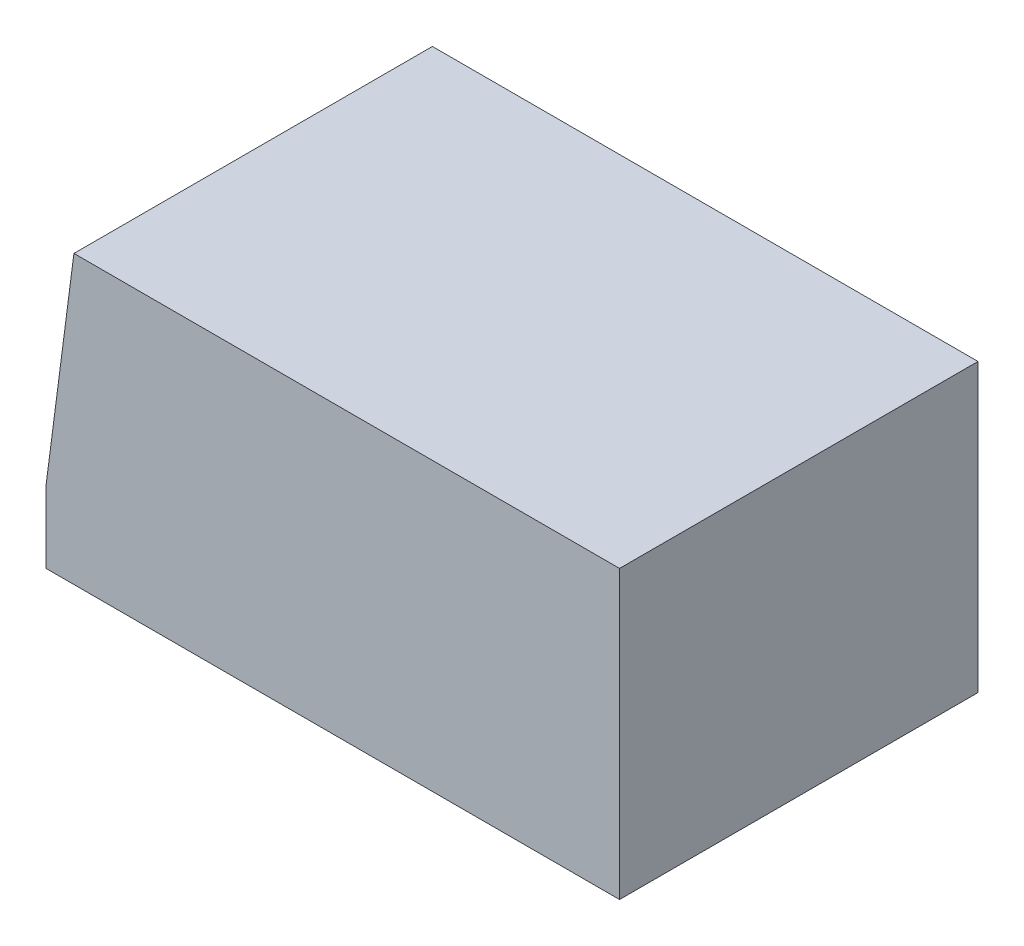
ISO-10303-21;
HEADER;
FILE_DESCRIPTION(('STEP AP214'),'2;1');
FILE_NAME('part.step','',(''),(''),'','','');
FILE_SCHEMA(('AUTOMOTIVE_DESIGN { 1 0 10303 214 1 1 1 1 }'));
ENDSEC;
DATA;
#1=APPLICATION_CONTEXT('core data for automotive mechanical design processes');
#2=APPLICATION_PROTOCOL_DEFINITION('international standard','automotive_design',2000,#1);
#3=PRODUCT_CONTEXT('',#1,'mechanical');
#4=PRODUCT('Part','Part','',(#3));
#5=PRODUCT_RELATED_PRODUCT_CATEGORY('part','',(#4));
#6=PRODUCT_DEFINITION_FORMATION('','',#4);
#7=PRODUCT_DEFINITION_CONTEXT('part definition',#1,'design');
#8=PRODUCT_DEFINITION('design','',#6,#7);
#9=PRODUCT_DEFINITION_SHAPE('','',#8);
#10=(LENGTH_UNIT() NAMED_UNIT(*) SI_UNIT(.MILLI.,.METRE.));
#11=(NAMED_UNIT(*) PLANE_ANGLE_UNIT() SI_UNIT($,.RADIAN.));
#12=(NAMED_UNIT(*) SI_UNIT($,.STERADIAN.) SOLID_ANGLE_UNIT());
#13=UNCERTAINTY_MEASURE_WITH_UNIT(LENGTH_MEASURE(1.E-05),#10,'distance_accuracy_value','');
#14=(GEOMETRIC_REPRESENTATION_CONTEXT(3) GLOBAL_UNCERTAINTY_ASSIGNED_CONTEXT((#13)) GLOBAL_UNIT_ASSIGNED_CONTEXT((#10,
#11,#12)) REPRESENTATION_CONTEXT('',''));
#15=CARTESIAN_POINT('',(0.,0.,0.));
#16=DIRECTION('',(0.,0.,1.));
#17=DIRECTION('',(1.,0.,0.));
#18=AXIS2_PLACEMENT_3D('',#15,#16,#17);
#19=CARTESIAN_POINT('',(40.,40.,25.));
#20=DIRECTION('',(-1.,0.,0.));
#21=DIRECTION('',(0.,0.,1.));
#22=AXIS2_PLACEMENT_3D('',#19,#20,#21);
#23=PLANE('',#22);
#24=DIRECTION('',(0.,0.,-1.));
#25=VECTOR('',#24,1.);
#26=CARTESIAN_POINT('',(40.,0.,25.));
#27=LINE('',#26,#25);
#28=CARTESIAN_POINT('',(40.,0.,25.));
#29=VERTEX_POINT('',#28);
#30=CARTESIAN_POINT('',(40.,0.,-25.));
#31=VERTEX_POINT('',#30);
#32=EDGE_CURVE('E100',#29,#31,#27,.T.);
#33=ORIENTED_EDGE('',*,*,#32,.T.);
#34=DIRECTION('',(0.,-1.,0.));
#35=VECTOR('',#34,1.);
#36=CARTESIAN_POINT('',(40.,40.,-25.));
#37=LINE('',#36,#35);
#38=CARTESIAN_POINT('',(40.,40.,-25.));
#39=VERTEX_POINT('',#38);
#40=EDGE_CURVE('E83',#39,#31,#37,.T.);
#41=ORIENTED_EDGE('',*,*,#40,.F.);
#42=DIRECTION('',(0.,0.,-1.));
#43=VECTOR('',#42,1.);
#44=CARTESIAN_POINT('',(40.,40.,25.));
#45=LINE('',#44,#43);
#46=CARTESIAN_POINT('',(40.,40.,25.));
#47=VERTEX_POINT('',#46);
#48=EDGE_CURVE('E90',#47,#39,#45,.T.);
#49=ORIENTED_EDGE('',*,*,#48,.F.);
#50=DIRECTION('',(0.,-1.,0.));
#51=VECTOR('',#50,1.);
#52=CARTESIAN_POINT('',(40.,40.,25.));
#53=LINE('',#52,#51);
#54=EDGE_CURVE('E110',#47,#29,#53,.T.);
#55=ORIENTED_EDGE('',*,*,#54,.T.);
#56=EDGE_LOOP('',(#33,#41,#49,#55));
#57=FACE_BOUND('',#56,.T.);
#58=ADVANCED_FACE('F33',(#57),#23,.F.);
#59=CARTESIAN_POINT('',(-40.,40.,-25.));
#60=DIRECTION('',(0.,0.,1.));
#61=DIRECTION('',(1.,0.,0.));
#62=AXIS2_PLACEMENT_3D('',#59,#60,#61);
#63=PLANE('',#62);
#64=DIRECTION('',(0.,-1.,0.));
#65=VECTOR('',#64,1.);
#66=CARTESIAN_POINT('',(-40.,40.,-25.));
#67=LINE('',#66,#65);
#68=CARTESIAN_POINT('',(-40.,9.99999999999921,-25.));
#69=VERTEX_POINT('',#68);
#70=CARTESIAN_POINT('',(-40.,0.,-25.));
#71=VERTEX_POINT('',#70);
#72=EDGE_CURVE('E102',#69,#71,#67,.T.);
#73=ORIENTED_EDGE('',*,*,#72,.F.);
#74=DIRECTION('',(-0.12879559657756,-0.991671162383091,0.));
#75=VECTOR('',#74,1.);
#76=CARTESIAN_POINT('',(-36.1036802884924,40.,-25.));
#77=LINE('',#76,#75);
#78=CARTESIAN_POINT('',(-36.1036802884924,40.,-25.));
#79=VERTEX_POINT('',#78);
#80=EDGE_CURVE('E11',#69,#79,#77,.F.);
#81=ORIENTED_EDGE('',*,*,#80,.T.);
#82=DIRECTION('',(-1.,0.,0.));
#83=VECTOR('',#82,1.);
#84=CARTESIAN_POINT('',(-40.,40.,-25.));
#85=LINE('',#84,#83);
#86=EDGE_CURVE('E78',#39,#79,#85,.T.);
#87=ORIENTED_EDGE('',*,*,#86,.F.);
#88=ORIENTED_EDGE('',*,*,#40,.T.);
#89=DIRECTION('',(-1.,0.,0.));
#90=VECTOR('',#89,1.);
#91=CARTESIAN_POINT('',(-40.,0.,-25.));
#92=LINE('',#91,#90);
#93=EDGE_CURVE('E116',#31,#71,#92,.T.);
#94=ORIENTED_EDGE('',*,*,#93,.T.);
#95=EDGE_LOOP('',(#73,#81,#87,#88,#94));
#96=FACE_BOUND('',#95,.T.);
#97=ADVANCED_FACE('F80',(#96),#63,.F.);
#98=CARTESIAN_POINT('',(-40.,40.,25.));
#99=DIRECTION('',(1.,0.,0.));
#100=DIRECTION('',(0.,0.,-1.));
#101=AXIS2_PLACEMENT_3D('',#98,#99,#100);
#102=PLANE('',#101);
#103=DIRECTION('',(0.,-1.,0.));
#104=VECTOR('',#103,1.);
#105=CARTESIAN_POINT('',(-40.,40.,25.));
#106=LINE('',#105,#104);
#107=CARTESIAN_POINT('',(-40.,9.99999999999921,25.));
#108=VERTEX_POINT('',#107);
#109=CARTESIAN_POINT('',(-40.,0.,25.));
#110=VERTEX_POINT('',#109);
#111=EDGE_CURVE('E105',#108,#110,#106,.T.);
#112=ORIENTED_EDGE('',*,*,#111,.F.);
#113=DIRECTION('',(0.,0.,-1.));
#114=VECTOR('',#113,1.);
#115=CARTESIAN_POINT('',(-40.,9.99999999999921,25.));
#116=LINE('',#115,#114);
#117=EDGE_CURVE('E41',#108,#69,#116,.T.);
#118=ORIENTED_EDGE('',*,*,#117,.T.);
#119=ORIENTED_EDGE('',*,*,#72,.T.);
#120=DIRECTION('',(0.,0.,1.));
#121=VECTOR('',#120,1.);
#122=CARTESIAN_POINT('',(-40.,0.,25.));
#123=LINE('',#122,#121);
#124=EDGE_CURVE('E113',#71,#110,#123,.T.);
#125=ORIENTED_EDGE('',*,*,#124,.T.);
#126=EDGE_LOOP('',(#112,#118,#119,#125));
#127=FACE_BOUND('',#126,.T.);
#128=ADVANCED_FACE('F142',(#127),#102,.F.);
#129=CARTESIAN_POINT('',(-40.,40.,25.));
#130=DIRECTION('',(0.,0.,-1.));
#131=DIRECTION('',(-1.,0.,0.));
#132=AXIS2_PLACEMENT_3D('',#129,#130,#131);
#133=PLANE('',#132);
#134=DIRECTION('',(1.,0.,0.));
#135=VECTOR('',#134,1.);
#136=CARTESIAN_POINT('',(-40.,40.,25.));
#137=LINE('',#136,#135);
#138=CARTESIAN_POINT('',(-36.1036802884924,40.,25.));
#139=VERTEX_POINT('',#138);
#140=EDGE_CURVE('E89',#139,#47,#137,.T.);
#141=ORIENTED_EDGE('',*,*,#140,.F.);
#142=DIRECTION('',(0.12879559657756,0.991671162383091,0.));
#143=VECTOR('',#142,1.);
#144=CARTESIAN_POINT('',(-36.1036802884924,40.,25.));
#145=LINE('',#144,#143);
#146=EDGE_CURVE('E55',#139,#108,#145,.F.);
#147=ORIENTED_EDGE('',*,*,#146,.T.);
#148=ORIENTED_EDGE('',*,*,#111,.T.);
#149=DIRECTION('',(1.,0.,0.));
#150=VECTOR('',#149,1.);
#151=CARTESIAN_POINT('',(-40.,0.,25.));
#152=LINE('',#151,#150);
#153=EDGE_CURVE('E97',#110,#29,#152,.T.);
#154=ORIENTED_EDGE('',*,*,#153,.T.);
#155=ORIENTED_EDGE('',*,*,#54,.F.);
#156=EDGE_LOOP('',(#141,#147,#148,#154,#155));
#157=FACE_BOUND('',#156,.T.);
#158=ADVANCED_FACE('F138',(#157),#133,.F.);
#159=CARTESIAN_POINT('',(0.,40.,0.));
#160=DIRECTION('',(0.,-1.,0.));
#161=DIRECTION('',(0.,0.,-1.));
#162=AXIS2_PLACEMENT_3D('',#159,#160,#161);
#163=PLANE('',#162);
#164=ORIENTED_EDGE('',*,*,#86,.T.);
#165=DIRECTION('',(0.,0.,1.));
#166=VECTOR('',#165,1.);
#167=CARTESIAN_POINT('',(-36.1036802884924,40.,0.));
#168=LINE('',#167,#166);
#169=EDGE_CURVE('E101',#79,#139,#168,.T.);
#170=ORIENTED_EDGE('',*,*,#169,.T.);
#171=ORIENTED_EDGE('',*,*,#140,.T.);
#172=ORIENTED_EDGE('',*,*,#48,.T.);
#173=EDGE_LOOP('',(#164,#170,#171,#172));
#174=FACE_BOUND('',#173,.T.);
#175=ADVANCED_FACE('F93',(#174),#163,.F.);
#176=CARTESIAN_POINT('',(0.,0.,0.));
#177=DIRECTION('',(0.,-1.,0.));
#178=DIRECTION('',(0.,0.,-1.));
#179=AXIS2_PLACEMENT_3D('',#176,#177,#178);
#180=PLANE('',#179);
#181=ORIENTED_EDGE('',*,*,#32,.F.);
#182=ORIENTED_EDGE('',*,*,#153,.F.);
#183=ORIENTED_EDGE('',*,*,#124,.F.);
#184=ORIENTED_EDGE('',*,*,#93,.F.);
#185=EDGE_LOOP('',(#181,#182,#183,#184));
#186=FACE_BOUND('',#185,.T.);
#187=ADVANCED_FACE('F137',(#186),#180,.T.);
#188=CARTESIAN_POINT('',(-36.1036802884924,40.,0.));
#189=DIRECTION('',(0.991671162383091,-0.12879559657756,0.));
#190=DIRECTION('',(0.,0.,1.));
#191=AXIS2_PLACEMENT_3D('',#188,#189,#190);
#192=PLANE('',#191);
#193=CARTESIAN_POINT('',(-38.1778402878781,24.0298526330388,0.));
#194=DIRECTION('',(-0.991671162383091,0.12879559657756,0.));
#195=DIRECTION('',(-0.12879559657756,-0.991671162383091,0.));
#196=AXIS2_PLACEMENT_3D('',#193,#194,#195);
#197=CIRCLE('',#196,12.5);
#198=CARTESIAN_POINT('',(-39.7877852450976,11.6339631032501,0.));
#199=VERTEX_POINT('',#198);
#200=EDGE_CURVE('E121',#199,#199,#197,.T.);
#201=ORIENTED_EDGE('',*,*,#200,.F.);
#202=EDGE_LOOP('',(#201));
#203=FACE_BOUND('',#202,.T.);
#204=ORIENTED_EDGE('',*,*,#80,.F.);
#205=ORIENTED_EDGE('',*,*,#117,.F.);
#206=ORIENTED_EDGE('',*,*,#146,.F.);
#207=ORIENTED_EDGE('',*,*,#169,.F.);
#208=EDGE_LOOP('',(#204,#205,#206,#207));
#209=FACE_BOUND('',#208,.T.);
#210=ADVANCED_FACE('F35',(#203,#209),#192,.F.);
#211=CARTESIAN_POINT('',(1.48900620744555,18.8780287699364,0.));
#212=DIRECTION('',(-0.991671162383091,0.12879559657756,0.));
#213=DIRECTION('',(-0.12879559657756,-0.991671162383091,0.));
#214=AXIS2_PLACEMENT_3D('',#211,#212,#213);
#215=CYLINDRICAL_SURFACE('',#214,12.5);
#216=CARTESIAN_POINT('',(1.48900620744555,18.8780287699364,0.));
#217=DIRECTION('',(-0.991671162383091,0.12879559657756,0.));
#218=DIRECTION('',(-0.12879559657756,-0.991671162383091,0.));
#219=AXIS2_PLACEMENT_3D('',#216,#217,#218);
#220=CIRCLE('',#219,12.5);
#221=CARTESIAN_POINT('',(-0.120938749773947,6.48213924014773,0.));
#222=VERTEX_POINT('',#221);
#223=EDGE_CURVE('E119',#222,#222,#220,.T.);
#224=ORIENTED_EDGE('',*,*,#223,.F.);
#225=EDGE_LOOP('',(#224));
#226=FACE_BOUND('',#225,.T.);
#227=ORIENTED_EDGE('',*,*,#200,.T.);
#228=EDGE_LOOP('',(#227));
#229=FACE_BOUND('',#228,.T.);
#230=ADVANCED_FACE('F129',(#226,#229),#215,.F.);
#231=CARTESIAN_POINT('',(1.48900620744555,18.8780287699364,0.));
#232=DIRECTION('',(-0.991671162383091,0.12879559657756,0.));
#233=DIRECTION('',(-0.12879559657756,-0.991671162383091,0.));
#234=AXIS2_PLACEMENT_3D('',#231,#232,#233);
#235=PLANE('',#234);
#236=ORIENTED_EDGE('',*,*,#223,.T.);
#237=EDGE_LOOP('',(#236));
#238=FACE_BOUND('',#237,.T.);
#239=ADVANCED_FACE('F127',(#238),#235,.T.);
#240=CLOSED_SHELL('',(#58,#97,#128,#158,#175,#187,#210,#230,#239));
#241=MANIFOLD_SOLID_BREP('B2',#240);
#242=ADVANCED_BREP_SHAPE_REPRESENTATION('',(#18,#241),#14);
#243=SHAPE_DEFINITION_REPRESENTATION(#9,#242);
ENDSEC;
END-ISO-10303-21;
